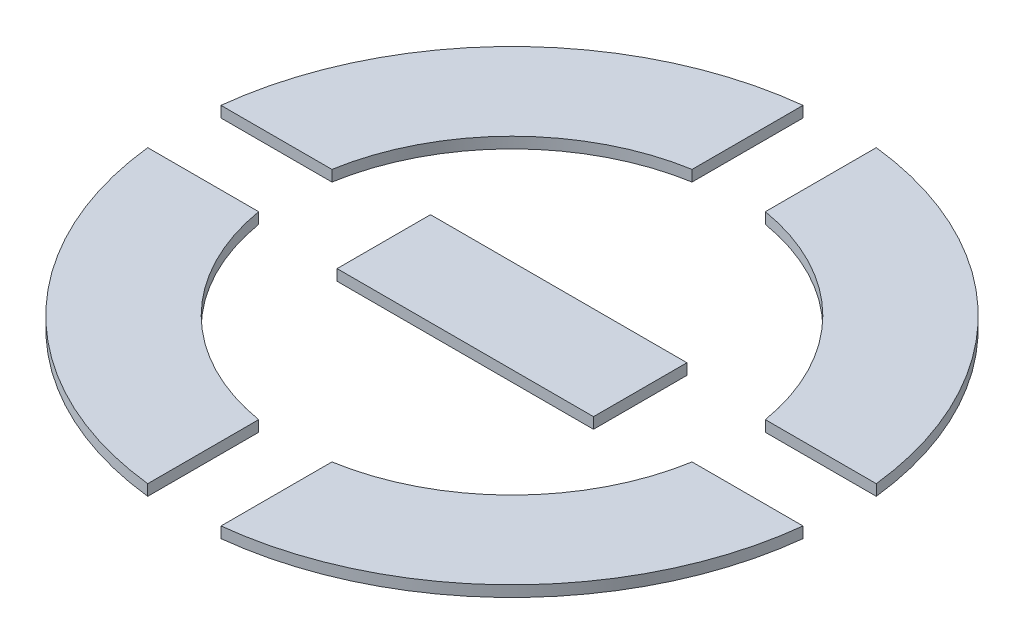
ISO-10303-21;
HEADER;
FILE_DESCRIPTION(('STEP AP214'),'2;1');
FILE_NAME('part.step','',(''),(''),'','','');
FILE_SCHEMA(('AUTOMOTIVE_DESIGN { 1 0 10303 214 1 1 1 1 }'));
ENDSEC;
DATA;
#1=APPLICATION_CONTEXT('core data for automotive mechanical design processes');
#2=APPLICATION_PROTOCOL_DEFINITION('international standard','automotive_design',2000,#1);
#3=PRODUCT_CONTEXT('',#1,'mechanical');
#4=PRODUCT('Part','Part','',(#3));
#5=PRODUCT_RELATED_PRODUCT_CATEGORY('part','',(#4));
#6=PRODUCT_DEFINITION_FORMATION('','',#4);
#7=PRODUCT_DEFINITION_CONTEXT('part definition',#1,'design');
#8=PRODUCT_DEFINITION('design','',#6,#7);
#9=PRODUCT_DEFINITION_SHAPE('','',#8);
#10=(LENGTH_UNIT() NAMED_UNIT(*) SI_UNIT(.MILLI.,.METRE.));
#11=(NAMED_UNIT(*) PLANE_ANGLE_UNIT() SI_UNIT($,.RADIAN.));
#12=(NAMED_UNIT(*) SI_UNIT($,.STERADIAN.) SOLID_ANGLE_UNIT());
#13=UNCERTAINTY_MEASURE_WITH_UNIT(LENGTH_MEASURE(1.E-05),#10,'distance_accuracy_value','');
#14=(GEOMETRIC_REPRESENTATION_CONTEXT(3) GLOBAL_UNCERTAINTY_ASSIGNED_CONTEXT((#13)) GLOBAL_UNIT_ASSIGNED_CONTEXT((#10,
#11,#12)) REPRESENTATION_CONTEXT('',''));
#15=CARTESIAN_POINT('',(0.,0.,0.));
#16=DIRECTION('',(0.,0.,1.));
#17=DIRECTION('',(1.,0.,0.));
#18=AXIS2_PLACEMENT_3D('',#15,#16,#17);
#19=CARTESIAN_POINT('',(0.,3.,0.));
#20=DIRECTION('',(0.,-1.,0.));
#21=DIRECTION('',(0.,0.,-1.));
#22=AXIS2_PLACEMENT_3D('',#19,#20,#21);
#23=CYLINDRICAL_SURFACE('',#22,60.);
#24=CARTESIAN_POINT('',(0.,0.,0.));
#25=DIRECTION('',(0.,-1.,0.));
#26=DIRECTION('',(0.,0.,1.));
#27=AXIS2_PLACEMENT_3D('',#24,#25,#26);
#28=CIRCLE('',#27,60.);
#29=CARTESIAN_POINT('',(-10.,0.,59.1607978309962));
#30=VERTEX_POINT('',#29);
#31=CARTESIAN_POINT('',(-59.1607978309962,0.,9.99999999999999));
#32=VERTEX_POINT('',#31);
#33=EDGE_CURVE('E130',#30,#32,#28,.T.);
#34=ORIENTED_EDGE('',*,*,#33,.T.);
#35=DIRECTION('',(0.,-1.,0.));
#36=VECTOR('',#35,1.);
#37=CARTESIAN_POINT('',(-59.1607978309962,3.,9.99999999999999));
#38=LINE('',#37,#36);
#39=CARTESIAN_POINT('',(-59.1607978309962,3.,9.99999999999999));
#40=VERTEX_POINT('',#39);
#41=EDGE_CURVE('E13',#40,#32,#38,.T.);
#42=ORIENTED_EDGE('',*,*,#41,.F.);
#43=CARTESIAN_POINT('',(0.,3.,0.));
#44=DIRECTION('',(0.,-1.,0.));
#45=DIRECTION('',(0.,0.,1.));
#46=AXIS2_PLACEMENT_3D('',#43,#44,#45);
#47=CIRCLE('',#46,60.);
#48=CARTESIAN_POINT('',(-10.,3.,59.1607978309962));
#49=VERTEX_POINT('',#48);
#50=EDGE_CURVE('E99',#49,#40,#47,.T.);
#51=ORIENTED_EDGE('',*,*,#50,.F.);
#52=DIRECTION('',(0.,-1.,0.));
#53=VECTOR('',#52,1.);
#54=CARTESIAN_POINT('',(-10.,3.,59.1607978309962));
#55=LINE('',#54,#53);
#56=EDGE_CURVE('E110',#49,#30,#55,.T.);
#57=ORIENTED_EDGE('',*,*,#56,.T.);
#58=EDGE_LOOP('',(#34,#42,#51,#57));
#59=FACE_BOUND('',#58,.T.);
#60=ADVANCED_FACE('F48',(#59),#23,.F.);
#61=CARTESIAN_POINT('',(-59.1607978309962,3.,9.99999999999999));
#62=DIRECTION('',(0.,0.,1.));
#63=DIRECTION('',(1.,0.,0.));
#64=AXIS2_PLACEMENT_3D('',#61,#62,#63);
#65=PLANE('',#64);
#66=DIRECTION('',(-1.,0.,0.));
#67=VECTOR('',#66,1.);
#68=CARTESIAN_POINT('',(-59.1607978309962,0.,9.99999999999999));
#69=LINE('',#68,#67);
#70=CARTESIAN_POINT('',(-89.4427190999916,0.,9.99999999999994));
#71=VERTEX_POINT('',#70);
#72=EDGE_CURVE('E104',#32,#71,#69,.T.);
#73=ORIENTED_EDGE('',*,*,#72,.T.);
#74=DIRECTION('',(0.,-1.,0.));
#75=VECTOR('',#74,1.);
#76=CARTESIAN_POINT('',(-89.4427190999916,3.,9.99999999999994));
#77=LINE('',#76,#75);
#78=CARTESIAN_POINT('',(-89.4427190999916,3.,9.99999999999994));
#79=VERTEX_POINT('',#78);
#80=EDGE_CURVE('E56',#79,#71,#77,.T.);
#81=ORIENTED_EDGE('',*,*,#80,.F.);
#82=DIRECTION('',(-1.,0.,0.));
#83=VECTOR('',#82,1.);
#84=CARTESIAN_POINT('',(-59.1607978309962,3.,9.99999999999999));
#85=LINE('',#84,#83);
#86=EDGE_CURVE('E94',#40,#79,#85,.T.);
#87=ORIENTED_EDGE('',*,*,#86,.F.);
#88=ORIENTED_EDGE('',*,*,#41,.T.);
#89=EDGE_LOOP('',(#73,#81,#87,#88));
#90=FACE_BOUND('',#89,.T.);
#91=ADVANCED_FACE('F103',(#90),#65,.F.);
#92=CARTESIAN_POINT('',(0.,3.,0.));
#93=DIRECTION('',(0.,-1.,0.));
#94=DIRECTION('',(0.,0.,-1.));
#95=AXIS2_PLACEMENT_3D('',#92,#93,#94);
#96=CYLINDRICAL_SURFACE('',#95,90.);
#97=CARTESIAN_POINT('',(0.,0.,0.));
#98=DIRECTION('',(0.,1.,0.));
#99=DIRECTION('',(0.,0.,1.));
#100=AXIS2_PLACEMENT_3D('',#97,#98,#99);
#101=CIRCLE('',#100,90.);
#102=CARTESIAN_POINT('',(-10.,0.,89.4427190999916));
#103=VERTEX_POINT('',#102);
#104=EDGE_CURVE('E81',#71,#103,#101,.T.);
#105=ORIENTED_EDGE('',*,*,#104,.T.);
#106=DIRECTION('',(0.,-1.,0.));
#107=VECTOR('',#106,1.);
#108=CARTESIAN_POINT('',(-10.,3.,89.4427190999916));
#109=LINE('',#108,#107);
#110=CARTESIAN_POINT('',(-10.,3.,89.4427190999916));
#111=VERTEX_POINT('',#110);
#112=EDGE_CURVE('E105',#111,#103,#109,.T.);
#113=ORIENTED_EDGE('',*,*,#112,.F.);
#114=CARTESIAN_POINT('',(0.,3.,0.));
#115=DIRECTION('',(0.,1.,0.));
#116=DIRECTION('',(0.,0.,1.));
#117=AXIS2_PLACEMENT_3D('',#114,#115,#116);
#118=CIRCLE('',#117,90.);
#119=EDGE_CURVE('E97',#79,#111,#118,.T.);
#120=ORIENTED_EDGE('',*,*,#119,.F.);
#121=ORIENTED_EDGE('',*,*,#80,.T.);
#122=EDGE_LOOP('',(#105,#113,#120,#121));
#123=FACE_BOUND('',#122,.T.);
#124=ADVANCED_FACE('F106',(#123),#96,.T.);
#125=CARTESIAN_POINT('',(-10.,3.,59.1607978309962));
#126=DIRECTION('',(-1.,0.,0.));
#127=DIRECTION('',(0.,0.,1.));
#128=AXIS2_PLACEMENT_3D('',#125,#126,#127);
#129=PLANE('',#128);
#130=DIRECTION('',(0.,0.,-1.));
#131=VECTOR('',#130,1.);
#132=CARTESIAN_POINT('',(-10.,0.,59.1607978309962));
#133=LINE('',#132,#131);
#134=EDGE_CURVE('E87',#103,#30,#133,.T.);
#135=ORIENTED_EDGE('',*,*,#134,.T.);
#136=ORIENTED_EDGE('',*,*,#56,.F.);
#137=DIRECTION('',(0.,0.,-1.));
#138=VECTOR('',#137,1.);
#139=CARTESIAN_POINT('',(-10.,3.,59.1607978309962));
#140=LINE('',#139,#138);
#141=EDGE_CURVE('E64',#111,#49,#140,.T.);
#142=ORIENTED_EDGE('',*,*,#141,.F.);
#143=ORIENTED_EDGE('',*,*,#112,.T.);
#144=EDGE_LOOP('',(#135,#136,#142,#143));
#145=FACE_BOUND('',#144,.T.);
#146=ADVANCED_FACE('F125',(#145),#129,.F.);
#147=CARTESIAN_POINT('',(0.,3.,0.));
#148=DIRECTION('',(0.,1.,0.));
#149=DIRECTION('',(0.,0.,1.));
#150=AXIS2_PLACEMENT_3D('',#147,#148,#149);
#151=PLANE('',#150);
#152=ORIENTED_EDGE('',*,*,#50,.T.);
#153=ORIENTED_EDGE('',*,*,#86,.T.);
#154=ORIENTED_EDGE('',*,*,#119,.T.);
#155=ORIENTED_EDGE('',*,*,#141,.T.);
#156=EDGE_LOOP('',(#152,#153,#154,#155));
#157=FACE_BOUND('',#156,.T.);
#158=ADVANCED_FACE('F95',(#157),#151,.T.);
#159=CARTESIAN_POINT('',(0.,0.,0.));
#160=DIRECTION('',(0.,1.,0.));
#161=DIRECTION('',(0.,0.,1.));
#162=AXIS2_PLACEMENT_3D('',#159,#160,#161);
#163=PLANE('',#162);
#164=ORIENTED_EDGE('',*,*,#33,.F.);
#165=ORIENTED_EDGE('',*,*,#134,.F.);
#166=ORIENTED_EDGE('',*,*,#104,.F.);
#167=ORIENTED_EDGE('',*,*,#72,.F.);
#168=EDGE_LOOP('',(#164,#165,#166,#167));
#169=FACE_BOUND('',#168,.T.);
#170=ADVANCED_FACE('F128',(#169),#163,.F.);
#171=CLOSED_SHELL('',(#60,#91,#124,#146,#158,#170));
#172=MANIFOLD_SOLID_BREP('B2',#171);
#173=CARTESIAN_POINT('',(0.,3.,0.));
#174=DIRECTION('',(0.,-1.,0.));
#175=DIRECTION('',(0.,0.,-1.));
#176=AXIS2_PLACEMENT_3D('',#173,#174,#175);
#177=CYLINDRICAL_SURFACE('',#176,60.);
#178=CARTESIAN_POINT('',(0.,0.,0.));
#179=DIRECTION('',(0.,-1.,0.));
#180=DIRECTION('',(0.,0.,1.));
#181=AXIS2_PLACEMENT_3D('',#178,#179,#180);
#182=CIRCLE('',#181,60.);
#183=CARTESIAN_POINT('',(59.1607978309962,0.,9.99999999999999));
#184=VERTEX_POINT('',#183);
#185=CARTESIAN_POINT('',(10.,0.,59.1607978309962));
#186=VERTEX_POINT('',#185);
#187=EDGE_CURVE('E276',#184,#186,#182,.T.);
#188=ORIENTED_EDGE('',*,*,#187,.T.);
#189=DIRECTION('',(0.,-1.,0.));
#190=VECTOR('',#189,1.);
#191=CARTESIAN_POINT('',(10.,3.,59.1607978309962));
#192=LINE('',#191,#190);
#193=CARTESIAN_POINT('',(10.,3.,59.1607978309962));
#194=VERTEX_POINT('',#193);
#195=EDGE_CURVE('E46',#194,#186,#192,.T.);
#196=ORIENTED_EDGE('',*,*,#195,.F.);
#197=CARTESIAN_POINT('',(0.,3.,0.));
#198=DIRECTION('',(0.,-1.,0.));
#199=DIRECTION('',(0.,0.,1.));
#200=AXIS2_PLACEMENT_3D('',#197,#198,#199);
#201=CIRCLE('',#200,60.);
#202=CARTESIAN_POINT('',(59.1607978309962,3.,9.99999999999999));
#203=VERTEX_POINT('',#202);
#204=EDGE_CURVE('E245',#203,#194,#201,.T.);
#205=ORIENTED_EDGE('',*,*,#204,.F.);
#206=DIRECTION('',(0.,-1.,0.));
#207=VECTOR('',#206,1.);
#208=CARTESIAN_POINT('',(59.1607978309962,3.,9.99999999999999));
#209=LINE('',#208,#207);
#210=EDGE_CURVE('E256',#203,#184,#209,.T.);
#211=ORIENTED_EDGE('',*,*,#210,.T.);
#212=EDGE_LOOP('',(#188,#196,#205,#211));
#213=FACE_BOUND('',#212,.T.);
#214=ADVANCED_FACE('F194',(#213),#177,.F.);
#215=CARTESIAN_POINT('',(10.,3.,59.1607978309962));
#216=DIRECTION('',(1.,0.,0.));
#217=DIRECTION('',(0.,0.,-1.));
#218=AXIS2_PLACEMENT_3D('',#215,#216,#217);
#219=PLANE('',#218);
#220=DIRECTION('',(0.,0.,1.));
#221=VECTOR('',#220,1.);
#222=CARTESIAN_POINT('',(10.,0.,59.1607978309962));
#223=LINE('',#222,#221);
#224=CARTESIAN_POINT('',(10.,0.,89.4427190999916));
#225=VERTEX_POINT('',#224);
#226=EDGE_CURVE('E250',#186,#225,#223,.T.);
#227=ORIENTED_EDGE('',*,*,#226,.T.);
#228=DIRECTION('',(0.,-1.,0.));
#229=VECTOR('',#228,1.);
#230=CARTESIAN_POINT('',(10.,3.,89.4427190999916));
#231=LINE('',#230,#229);
#232=CARTESIAN_POINT('',(10.,3.,89.4427190999916));
#233=VERTEX_POINT('',#232);
#234=EDGE_CURVE('E202',#233,#225,#231,.T.);
#235=ORIENTED_EDGE('',*,*,#234,.F.);
#236=DIRECTION('',(0.,0.,1.));
#237=VECTOR('',#236,1.);
#238=CARTESIAN_POINT('',(10.,3.,59.1607978309962));
#239=LINE('',#238,#237);
#240=EDGE_CURVE('E240',#194,#233,#239,.T.);
#241=ORIENTED_EDGE('',*,*,#240,.F.);
#242=ORIENTED_EDGE('',*,*,#195,.T.);
#243=EDGE_LOOP('',(#227,#235,#241,#242));
#244=FACE_BOUND('',#243,.T.);
#245=ADVANCED_FACE('F249',(#244),#219,.F.);
#246=CARTESIAN_POINT('',(0.,3.,0.));
#247=DIRECTION('',(0.,-1.,0.));
#248=DIRECTION('',(0.,0.,-1.));
#249=AXIS2_PLACEMENT_3D('',#246,#247,#248);
#250=CYLINDRICAL_SURFACE('',#249,90.);
#251=CARTESIAN_POINT('',(0.,0.,0.));
#252=DIRECTION('',(0.,1.,0.));
#253=DIRECTION('',(0.,0.,1.));
#254=AXIS2_PLACEMENT_3D('',#251,#252,#253);
#255=CIRCLE('',#254,90.);
#256=CARTESIAN_POINT('',(89.4427190999916,0.,9.99999999999998));
#257=VERTEX_POINT('',#256);
#258=EDGE_CURVE('E227',#225,#257,#255,.T.);
#259=ORIENTED_EDGE('',*,*,#258,.T.);
#260=DIRECTION('',(0.,-1.,0.));
#261=VECTOR('',#260,1.);
#262=CARTESIAN_POINT('',(89.4427190999916,3.,9.99999999999998));
#263=LINE('',#262,#261);
#264=CARTESIAN_POINT('',(89.4427190999916,3.,9.99999999999998));
#265=VERTEX_POINT('',#264);
#266=EDGE_CURVE('E251',#265,#257,#263,.T.);
#267=ORIENTED_EDGE('',*,*,#266,.F.);
#268=CARTESIAN_POINT('',(0.,3.,0.));
#269=DIRECTION('',(0.,1.,0.));
#270=DIRECTION('',(0.,0.,1.));
#271=AXIS2_PLACEMENT_3D('',#268,#269,#270);
#272=CIRCLE('',#271,90.);
#273=EDGE_CURVE('E243',#233,#265,#272,.T.);
#274=ORIENTED_EDGE('',*,*,#273,.F.);
#275=ORIENTED_EDGE('',*,*,#234,.T.);
#276=EDGE_LOOP('',(#259,#267,#274,#275));
#277=FACE_BOUND('',#276,.T.);
#278=ADVANCED_FACE('F252',(#277),#250,.T.);
#279=CARTESIAN_POINT('',(59.1607978309962,3.,9.99999999999999));
#280=DIRECTION('',(0.,0.,1.));
#281=DIRECTION('',(1.,0.,0.));
#282=AXIS2_PLACEMENT_3D('',#279,#280,#281);
#283=PLANE('',#282);
#284=DIRECTION('',(-1.,0.,0.));
#285=VECTOR('',#284,1.);
#286=CARTESIAN_POINT('',(59.1607978309962,0.,9.99999999999999));
#287=LINE('',#286,#285);
#288=EDGE_CURVE('E233',#257,#184,#287,.T.);
#289=ORIENTED_EDGE('',*,*,#288,.T.);
#290=ORIENTED_EDGE('',*,*,#210,.F.);
#291=DIRECTION('',(-1.,0.,0.));
#292=VECTOR('',#291,1.);
#293=CARTESIAN_POINT('',(59.1607978309962,3.,9.99999999999999));
#294=LINE('',#293,#292);
#295=EDGE_CURVE('E210',#265,#203,#294,.T.);
#296=ORIENTED_EDGE('',*,*,#295,.F.);
#297=ORIENTED_EDGE('',*,*,#266,.T.);
#298=EDGE_LOOP('',(#289,#290,#296,#297));
#299=FACE_BOUND('',#298,.T.);
#300=ADVANCED_FACE('F271',(#299),#283,.F.);
#301=CARTESIAN_POINT('',(0.,3.,0.));
#302=DIRECTION('',(0.,1.,0.));
#303=DIRECTION('',(0.,0.,1.));
#304=AXIS2_PLACEMENT_3D('',#301,#302,#303);
#305=PLANE('',#304);
#306=ORIENTED_EDGE('',*,*,#204,.T.);
#307=ORIENTED_EDGE('',*,*,#240,.T.);
#308=ORIENTED_EDGE('',*,*,#273,.T.);
#309=ORIENTED_EDGE('',*,*,#295,.T.);
#310=EDGE_LOOP('',(#306,#307,#308,#309));
#311=FACE_BOUND('',#310,.T.);
#312=ADVANCED_FACE('F241',(#311),#305,.T.);
#313=CARTESIAN_POINT('',(0.,0.,0.));
#314=DIRECTION('',(0.,1.,0.));
#315=DIRECTION('',(0.,0.,1.));
#316=AXIS2_PLACEMENT_3D('',#313,#314,#315);
#317=PLANE('',#316);
#318=ORIENTED_EDGE('',*,*,#187,.F.);
#319=ORIENTED_EDGE('',*,*,#288,.F.);
#320=ORIENTED_EDGE('',*,*,#258,.F.);
#321=ORIENTED_EDGE('',*,*,#226,.F.);
#322=EDGE_LOOP('',(#318,#319,#320,#321));
#323=FACE_BOUND('',#322,.T.);
#324=ADVANCED_FACE('F274',(#323),#317,.F.);
#325=CLOSED_SHELL('',(#214,#245,#278,#300,#312,#324));
#326=MANIFOLD_SOLID_BREP('B7',#325);
#327=CARTESIAN_POINT('',(0.,3.,0.));
#328=DIRECTION('',(0.,-1.,0.));
#329=DIRECTION('',(0.,0.,-1.));
#330=AXIS2_PLACEMENT_3D('',#327,#328,#329);
#331=CYLINDRICAL_SURFACE('',#330,60.);
#332=CARTESIAN_POINT('',(0.,0.,0.));
#333=DIRECTION('',(0.,-1.,0.));
#334=DIRECTION('',(0.,0.,1.));
#335=AXIS2_PLACEMENT_3D('',#332,#333,#334);
#336=CIRCLE('',#335,60.);
#337=CARTESIAN_POINT('',(10.,0.,-59.1607978309962));
#338=VERTEX_POINT('',#337);
#339=CARTESIAN_POINT('',(59.1607978309962,0.,-9.99999999999999));
#340=VERTEX_POINT('',#339);
#341=EDGE_CURVE('E422',#338,#340,#336,.T.);
#342=ORIENTED_EDGE('',*,*,#341,.T.);
#343=DIRECTION('',(0.,-1.,0.));
#344=VECTOR('',#343,1.);
#345=CARTESIAN_POINT('',(59.1607978309962,3.,-9.99999999999999));
#346=LINE('',#345,#344);
#347=CARTESIAN_POINT('',(59.1607978309962,3.,-9.99999999999999));
#348=VERTEX_POINT('',#347);
#349=EDGE_CURVE('E192',#348,#340,#346,.T.);
#350=ORIENTED_EDGE('',*,*,#349,.F.);
#351=CARTESIAN_POINT('',(0.,3.,0.));
#352=DIRECTION('',(0.,-1.,0.));
#353=DIRECTION('',(0.,0.,1.));
#354=AXIS2_PLACEMENT_3D('',#351,#352,#353);
#355=CIRCLE('',#354,60.);
#356=CARTESIAN_POINT('',(10.,3.,-59.1607978309962));
#357=VERTEX_POINT('',#356);
#358=EDGE_CURVE('E391',#357,#348,#355,.T.);
#359=ORIENTED_EDGE('',*,*,#358,.F.);
#360=DIRECTION('',(0.,-1.,0.));
#361=VECTOR('',#360,1.);
#362=CARTESIAN_POINT('',(10.,3.,-59.1607978309962));
#363=LINE('',#362,#361);
#364=EDGE_CURVE('E402',#357,#338,#363,.T.);
#365=ORIENTED_EDGE('',*,*,#364,.T.);
#366=EDGE_LOOP('',(#342,#350,#359,#365));
#367=FACE_BOUND('',#366,.T.);
#368=ADVANCED_FACE('F340',(#367),#331,.F.);
#369=CARTESIAN_POINT('',(59.1607978309962,3.,-9.99999999999999));
#370=DIRECTION('',(0.,0.,-1.));
#371=DIRECTION('',(-1.,0.,0.));
#372=AXIS2_PLACEMENT_3D('',#369,#370,#371);
#373=PLANE('',#372);
#374=DIRECTION('',(1.,0.,0.));
#375=VECTOR('',#374,1.);
#376=CARTESIAN_POINT('',(59.1607978309962,0.,-9.99999999999999));
#377=LINE('',#376,#375);
#378=CARTESIAN_POINT('',(89.4427190999916,0.,-9.99999999999999));
#379=VERTEX_POINT('',#378);
#380=EDGE_CURVE('E396',#340,#379,#377,.T.);
#381=ORIENTED_EDGE('',*,*,#380,.T.);
#382=DIRECTION('',(0.,-1.,0.));
#383=VECTOR('',#382,1.);
#384=CARTESIAN_POINT('',(89.4427190999916,3.,-9.99999999999999));
#385=LINE('',#384,#383);
#386=CARTESIAN_POINT('',(89.4427190999916,3.,-9.99999999999999));
#387=VERTEX_POINT('',#386);
#388=EDGE_CURVE('E348',#387,#379,#385,.T.);
#389=ORIENTED_EDGE('',*,*,#388,.F.);
#390=DIRECTION('',(1.,0.,0.));
#391=VECTOR('',#390,1.);
#392=CARTESIAN_POINT('',(59.1607978309962,3.,-9.99999999999999));
#393=LINE('',#392,#391);
#394=EDGE_CURVE('E386',#348,#387,#393,.T.);
#395=ORIENTED_EDGE('',*,*,#394,.F.);
#396=ORIENTED_EDGE('',*,*,#349,.T.);
#397=EDGE_LOOP('',(#381,#389,#395,#396));
#398=FACE_BOUND('',#397,.T.);
#399=ADVANCED_FACE('F395',(#398),#373,.F.);
#400=CARTESIAN_POINT('',(0.,3.,0.));
#401=DIRECTION('',(0.,-1.,0.));
#402=DIRECTION('',(0.,0.,-1.));
#403=AXIS2_PLACEMENT_3D('',#400,#401,#402);
#404=CYLINDRICAL_SURFACE('',#403,90.);
#405=CARTESIAN_POINT('',(0.,0.,0.));
#406=DIRECTION('',(0.,1.,0.));
#407=DIRECTION('',(0.,0.,1.));
#408=AXIS2_PLACEMENT_3D('',#405,#406,#407);
#409=CIRCLE('',#408,90.);
#410=CARTESIAN_POINT('',(10.,0.,-89.4427190999916));
#411=VERTEX_POINT('',#410);
#412=EDGE_CURVE('E373',#379,#411,#409,.T.);
#413=ORIENTED_EDGE('',*,*,#412,.T.);
#414=DIRECTION('',(0.,-1.,0.));
#415=VECTOR('',#414,1.);
#416=CARTESIAN_POINT('',(10.,3.,-89.4427190999916));
#417=LINE('',#416,#415);
#418=CARTESIAN_POINT('',(10.,3.,-89.4427190999916));
#419=VERTEX_POINT('',#418);
#420=EDGE_CURVE('E397',#419,#411,#417,.T.);
#421=ORIENTED_EDGE('',*,*,#420,.F.);
#422=CARTESIAN_POINT('',(0.,3.,0.));
#423=DIRECTION('',(0.,1.,0.));
#424=DIRECTION('',(0.,0.,1.));
#425=AXIS2_PLACEMENT_3D('',#422,#423,#424);
#426=CIRCLE('',#425,90.);
#427=EDGE_CURVE('E389',#387,#419,#426,.T.);
#428=ORIENTED_EDGE('',*,*,#427,.F.);
#429=ORIENTED_EDGE('',*,*,#388,.T.);
#430=EDGE_LOOP('',(#413,#421,#428,#429));
#431=FACE_BOUND('',#430,.T.);
#432=ADVANCED_FACE('F398',(#431),#404,.T.);
#433=CARTESIAN_POINT('',(10.,3.,-59.1607978309962));
#434=DIRECTION('',(1.,0.,0.));
#435=DIRECTION('',(0.,0.,-1.));
#436=AXIS2_PLACEMENT_3D('',#433,#434,#435);
#437=PLANE('',#436);
#438=DIRECTION('',(0.,0.,1.));
#439=VECTOR('',#438,1.);
#440=CARTESIAN_POINT('',(10.,0.,-59.1607978309962));
#441=LINE('',#440,#439);
#442=EDGE_CURVE('E379',#411,#338,#441,.T.);
#443=ORIENTED_EDGE('',*,*,#442,.T.);
#444=ORIENTED_EDGE('',*,*,#364,.F.);
#445=DIRECTION('',(0.,0.,1.));
#446=VECTOR('',#445,1.);
#447=CARTESIAN_POINT('',(10.,3.,-59.1607978309962));
#448=LINE('',#447,#446);
#449=EDGE_CURVE('E356',#419,#357,#448,.T.);
#450=ORIENTED_EDGE('',*,*,#449,.F.);
#451=ORIENTED_EDGE('',*,*,#420,.T.);
#452=EDGE_LOOP('',(#443,#444,#450,#451));
#453=FACE_BOUND('',#452,.T.);
#454=ADVANCED_FACE('F417',(#453),#437,.F.);
#455=CARTESIAN_POINT('',(0.,3.,0.));
#456=DIRECTION('',(0.,1.,0.));
#457=DIRECTION('',(0.,0.,1.));
#458=AXIS2_PLACEMENT_3D('',#455,#456,#457);
#459=PLANE('',#458);
#460=ORIENTED_EDGE('',*,*,#358,.T.);
#461=ORIENTED_EDGE('',*,*,#394,.T.);
#462=ORIENTED_EDGE('',*,*,#427,.T.);
#463=ORIENTED_EDGE('',*,*,#449,.T.);
#464=EDGE_LOOP('',(#460,#461,#462,#463));
#465=FACE_BOUND('',#464,.T.);
#466=ADVANCED_FACE('F387',(#465),#459,.T.);
#467=CARTESIAN_POINT('',(0.,0.,0.));
#468=DIRECTION('',(0.,1.,0.));
#469=DIRECTION('',(0.,0.,1.));
#470=AXIS2_PLACEMENT_3D('',#467,#468,#469);
#471=PLANE('',#470);
#472=ORIENTED_EDGE('',*,*,#341,.F.);
#473=ORIENTED_EDGE('',*,*,#442,.F.);
#474=ORIENTED_EDGE('',*,*,#412,.F.);
#475=ORIENTED_EDGE('',*,*,#380,.F.);
#476=EDGE_LOOP('',(#472,#473,#474,#475));
#477=FACE_BOUND('',#476,.T.);
#478=ADVANCED_FACE('F420',(#477),#471,.F.);
#479=CLOSED_SHELL('',(#368,#399,#432,#454,#466,#478));
#480=MANIFOLD_SOLID_BREP('B40',#479);
#481=CARTESIAN_POINT('',(0.,3.,0.));
#482=DIRECTION('',(0.,-1.,0.));
#483=DIRECTION('',(0.,0.,-1.));
#484=AXIS2_PLACEMENT_3D('',#481,#482,#483);
#485=CYLINDRICAL_SURFACE('',#484,60.);
#486=CARTESIAN_POINT('',(0.,0.,0.));
#487=DIRECTION('',(0.,-1.,0.));
#488=DIRECTION('',(0.,0.,1.));
#489=AXIS2_PLACEMENT_3D('',#486,#487,#488);
#490=CIRCLE('',#489,60.);
#491=CARTESIAN_POINT('',(-59.1607978309962,0.,-9.99999999999999));
#492=VERTEX_POINT('',#491);
#493=CARTESIAN_POINT('',(-10.,0.,-59.1607978309962));
#494=VERTEX_POINT('',#493);
#495=EDGE_CURVE('E567',#492,#494,#490,.T.);
#496=ORIENTED_EDGE('',*,*,#495,.T.);
#497=DIRECTION('',(0.,-1.,0.));
#498=VECTOR('',#497,1.);
#499=CARTESIAN_POINT('',(-10.,3.,-59.1607978309962));
#500=LINE('',#499,#498);
#501=CARTESIAN_POINT('',(-10.,3.,-59.1607978309962));
#502=VERTEX_POINT('',#501);
#503=EDGE_CURVE('E338',#502,#494,#500,.T.);
#504=ORIENTED_EDGE('',*,*,#503,.F.);
#505=CARTESIAN_POINT('',(0.,3.,0.));
#506=DIRECTION('',(0.,-1.,0.));
#507=DIRECTION('',(0.,0.,1.));
#508=AXIS2_PLACEMENT_3D('',#505,#506,#507);
#509=CIRCLE('',#508,60.);
#510=CARTESIAN_POINT('',(-59.1607978309962,3.,-9.99999999999999));
#511=VERTEX_POINT('',#510);
#512=EDGE_CURVE('E536',#511,#502,#509,.T.);
#513=ORIENTED_EDGE('',*,*,#512,.F.);
#514=DIRECTION('',(0.,-1.,0.));
#515=VECTOR('',#514,1.);
#516=CARTESIAN_POINT('',(-59.1607978309962,3.,-9.99999999999999));
#517=LINE('',#516,#515);
#518=EDGE_CURVE('E547',#511,#492,#517,.T.);
#519=ORIENTED_EDGE('',*,*,#518,.T.);
#520=EDGE_LOOP('',(#496,#504,#513,#519));
#521=FACE_BOUND('',#520,.T.);
#522=ADVANCED_FACE('F485',(#521),#485,.F.);
#523=CARTESIAN_POINT('',(-10.,3.,-59.1607978309962));
#524=DIRECTION('',(-1.,0.,0.));
#525=DIRECTION('',(0.,0.,1.));
#526=AXIS2_PLACEMENT_3D('',#523,#524,#525);
#527=PLANE('',#526);
#528=DIRECTION('',(0.,0.,-1.));
#529=VECTOR('',#528,1.);
#530=CARTESIAN_POINT('',(-10.,0.,-59.1607978309962));
#531=LINE('',#530,#529);
#532=CARTESIAN_POINT('',(-10.,0.,-89.4427190999916));
#533=VERTEX_POINT('',#532);
#534=EDGE_CURVE('E541',#494,#533,#531,.T.);
#535=ORIENTED_EDGE('',*,*,#534,.T.);
#536=DIRECTION('',(0.,-1.,0.));
#537=VECTOR('',#536,1.);
#538=CARTESIAN_POINT('',(-10.,3.,-89.4427190999916));
#539=LINE('',#538,#537);
#540=CARTESIAN_POINT('',(-10.,3.,-89.4427190999916));
#541=VERTEX_POINT('',#540);
#542=EDGE_CURVE('E493',#541,#533,#539,.T.);
#543=ORIENTED_EDGE('',*,*,#542,.F.);
#544=DIRECTION('',(0.,0.,-1.));
#545=VECTOR('',#544,1.);
#546=CARTESIAN_POINT('',(-10.,3.,-59.1607978309962));
#547=LINE('',#546,#545);
#548=EDGE_CURVE('E531',#502,#541,#547,.T.);
#549=ORIENTED_EDGE('',*,*,#548,.F.);
#550=ORIENTED_EDGE('',*,*,#503,.T.);
#551=EDGE_LOOP('',(#535,#543,#549,#550));
#552=FACE_BOUND('',#551,.T.);
#553=ADVANCED_FACE('F540',(#552),#527,.F.);
#554=CARTESIAN_POINT('',(0.,3.,0.));
#555=DIRECTION('',(0.,-1.,0.));
#556=DIRECTION('',(0.,0.,-1.));
#557=AXIS2_PLACEMENT_3D('',#554,#555,#556);
#558=CYLINDRICAL_SURFACE('',#557,90.);
#559=CARTESIAN_POINT('',(0.,0.,0.));
#560=DIRECTION('',(0.,1.,0.));
#561=DIRECTION('',(0.,0.,1.));
#562=AXIS2_PLACEMENT_3D('',#559,#560,#561);
#563=CIRCLE('',#562,90.);
#564=CARTESIAN_POINT('',(-89.4427190999916,0.,-9.99999999999998));
#565=VERTEX_POINT('',#564);
#566=EDGE_CURVE('E518',#533,#565,#563,.T.);
#567=ORIENTED_EDGE('',*,*,#566,.T.);
#568=DIRECTION('',(0.,-1.,0.));
#569=VECTOR('',#568,1.);
#570=CARTESIAN_POINT('',(-89.4427190999916,3.,-9.99999999999998));
#571=LINE('',#570,#569);
#572=CARTESIAN_POINT('',(-89.4427190999916,3.,-9.99999999999998));
#573=VERTEX_POINT('',#572);
#574=EDGE_CURVE('E542',#573,#565,#571,.T.);
#575=ORIENTED_EDGE('',*,*,#574,.F.);
#576=CARTESIAN_POINT('',(0.,3.,0.));
#577=DIRECTION('',(0.,1.,0.));
#578=DIRECTION('',(0.,0.,1.));
#579=AXIS2_PLACEMENT_3D('',#576,#577,#578);
#580=CIRCLE('',#579,90.);
#581=EDGE_CURVE('E534',#541,#573,#580,.T.);
#582=ORIENTED_EDGE('',*,*,#581,.F.);
#583=ORIENTED_EDGE('',*,*,#542,.T.);
#584=EDGE_LOOP('',(#567,#575,#582,#583));
#585=FACE_BOUND('',#584,.T.);
#586=ADVANCED_FACE('F543',(#585),#558,.T.);
#587=CARTESIAN_POINT('',(-59.1607978309962,3.,-9.99999999999999));
#588=DIRECTION('',(0.,0.,-1.));
#589=DIRECTION('',(-1.,0.,0.));
#590=AXIS2_PLACEMENT_3D('',#587,#588,#589);
#591=PLANE('',#590);
#592=DIRECTION('',(1.,0.,0.));
#593=VECTOR('',#592,1.);
#594=CARTESIAN_POINT('',(-59.1607978309962,0.,-9.99999999999999));
#595=LINE('',#594,#593);
#596=EDGE_CURVE('E524',#565,#492,#595,.T.);
#597=ORIENTED_EDGE('',*,*,#596,.T.);
#598=ORIENTED_EDGE('',*,*,#518,.F.);
#599=DIRECTION('',(1.,0.,0.));
#600=VECTOR('',#599,1.);
#601=CARTESIAN_POINT('',(-59.1607978309962,3.,-9.99999999999999));
#602=LINE('',#601,#600);
#603=EDGE_CURVE('E501',#573,#511,#602,.T.);
#604=ORIENTED_EDGE('',*,*,#603,.F.);
#605=ORIENTED_EDGE('',*,*,#574,.T.);
#606=EDGE_LOOP('',(#597,#598,#604,#605));
#607=FACE_BOUND('',#606,.T.);
#608=ADVANCED_FACE('F562',(#607),#591,.F.);
#609=CARTESIAN_POINT('',(0.,3.,0.));
#610=DIRECTION('',(0.,1.,0.));
#611=DIRECTION('',(0.,0.,1.));
#612=AXIS2_PLACEMENT_3D('',#609,#610,#611);
#613=PLANE('',#612);
#614=ORIENTED_EDGE('',*,*,#512,.T.);
#615=ORIENTED_EDGE('',*,*,#548,.T.);
#616=ORIENTED_EDGE('',*,*,#581,.T.);
#617=ORIENTED_EDGE('',*,*,#603,.T.);
#618=EDGE_LOOP('',(#614,#615,#616,#617));
#619=FACE_BOUND('',#618,.T.);
#620=ADVANCED_FACE('F532',(#619),#613,.T.);
#621=CARTESIAN_POINT('',(0.,0.,0.));
#622=DIRECTION('',(0.,1.,0.));
#623=DIRECTION('',(0.,0.,1.));
#624=AXIS2_PLACEMENT_3D('',#621,#622,#623);
#625=PLANE('',#624);
#626=ORIENTED_EDGE('',*,*,#495,.F.);
#627=ORIENTED_EDGE('',*,*,#596,.F.);
#628=ORIENTED_EDGE('',*,*,#566,.F.);
#629=ORIENTED_EDGE('',*,*,#534,.F.);
#630=EDGE_LOOP('',(#626,#627,#628,#629));
#631=FACE_BOUND('',#630,.T.);
#632=ADVANCED_FACE('F565',(#631),#625,.F.);
#633=CLOSED_SHELL('',(#522,#553,#586,#608,#620,#632));
#634=MANIFOLD_SOLID_BREP('B186',#633);
#635=CARTESIAN_POINT('',(35.,3.,-12.75));
#636=DIRECTION('',(-1.,0.,0.));
#637=DIRECTION('',(0.,0.,1.));
#638=AXIS2_PLACEMENT_3D('',#635,#636,#637);
#639=PLANE('',#638);
#640=DIRECTION('',(0.,0.,-1.));
#641=VECTOR('',#640,1.);
#642=CARTESIAN_POINT('',(35.,0.,-12.75));
#643=LINE('',#642,#641);
#644=CARTESIAN_POINT('',(35.,0.,12.75));
#645=VERTEX_POINT('',#644);
#646=CARTESIAN_POINT('',(35.,0.,-12.75));
#647=VERTEX_POINT('',#646);
#648=EDGE_CURVE('E702',#645,#647,#643,.T.);
#649=ORIENTED_EDGE('',*,*,#648,.T.);
#650=DIRECTION('',(0.,-1.,0.));
#651=VECTOR('',#650,1.);
#652=CARTESIAN_POINT('',(35.,3.,-12.75));
#653=LINE('',#652,#651);
#654=CARTESIAN_POINT('',(35.,3.,-12.75));
#655=VERTEX_POINT('',#654);
#656=EDGE_CURVE('E483',#655,#647,#653,.T.);
#657=ORIENTED_EDGE('',*,*,#656,.F.);
#658=DIRECTION('',(0.,0.,-1.));
#659=VECTOR('',#658,1.);
#660=CARTESIAN_POINT('',(35.,3.,-12.75));
#661=LINE('',#660,#659);
#662=CARTESIAN_POINT('',(35.,3.,12.75));
#663=VERTEX_POINT('',#662);
#664=EDGE_CURVE('E671',#663,#655,#661,.T.);
#665=ORIENTED_EDGE('',*,*,#664,.F.);
#666=DIRECTION('',(0.,-1.,0.));
#667=VECTOR('',#666,1.);
#668=CARTESIAN_POINT('',(35.,3.,12.75));
#669=LINE('',#668,#667);
#670=EDGE_CURVE('E682',#663,#645,#669,.T.);
#671=ORIENTED_EDGE('',*,*,#670,.T.);
#672=EDGE_LOOP('',(#649,#657,#665,#671));
#673=FACE_BOUND('',#672,.T.);
#674=ADVANCED_FACE('F620',(#673),#639,.F.);
#675=CARTESIAN_POINT('',(-35.,3.,-12.75));
#676=DIRECTION('',(0.,0.,1.));
#677=DIRECTION('',(1.,0.,0.));
#678=AXIS2_PLACEMENT_3D('',#675,#676,#677);
#679=PLANE('',#678);
#680=DIRECTION('',(-1.,0.,0.));
#681=VECTOR('',#680,1.);
#682=CARTESIAN_POINT('',(-35.,0.,-12.75));
#683=LINE('',#682,#681);
#684=CARTESIAN_POINT('',(-35.,0.,-12.75));
#685=VERTEX_POINT('',#684);
#686=EDGE_CURVE('E676',#647,#685,#683,.T.);
#687=ORIENTED_EDGE('',*,*,#686,.T.);
#688=DIRECTION('',(0.,-1.,0.));
#689=VECTOR('',#688,1.);
#690=CARTESIAN_POINT('',(-35.,3.,-12.75));
#691=LINE('',#690,#689);
#692=CARTESIAN_POINT('',(-35.,3.,-12.75));
#693=VERTEX_POINT('',#692);
#694=EDGE_CURVE('E628',#693,#685,#691,.T.);
#695=ORIENTED_EDGE('',*,*,#694,.F.);
#696=DIRECTION('',(-1.,0.,0.));
#697=VECTOR('',#696,1.);
#698=CARTESIAN_POINT('',(-35.,3.,-12.75));
#699=LINE('',#698,#697);
#700=EDGE_CURVE('E666',#655,#693,#699,.T.);
#701=ORIENTED_EDGE('',*,*,#700,.F.);
#702=ORIENTED_EDGE('',*,*,#656,.T.);
#703=EDGE_LOOP('',(#687,#695,#701,#702));
#704=FACE_BOUND('',#703,.T.);
#705=ADVANCED_FACE('F675',(#704),#679,.F.);
#706=CARTESIAN_POINT('',(-35.,3.,-12.75));
#707=DIRECTION('',(1.,0.,0.));
#708=DIRECTION('',(0.,0.,-1.));
#709=AXIS2_PLACEMENT_3D('',#706,#707,#708);
#710=PLANE('',#709);
#711=DIRECTION('',(0.,0.,1.));
#712=VECTOR('',#711,1.);
#713=CARTESIAN_POINT('',(-35.,0.,-12.75));
#714=LINE('',#713,#712);
#715=CARTESIAN_POINT('',(-35.,0.,12.75));
#716=VERTEX_POINT('',#715);
#717=EDGE_CURVE('E653',#685,#716,#714,.T.);
#718=ORIENTED_EDGE('',*,*,#717,.T.);
#719=DIRECTION('',(0.,-1.,0.));
#720=VECTOR('',#719,1.);
#721=CARTESIAN_POINT('',(-35.,3.,12.75));
#722=LINE('',#721,#720);
#723=CARTESIAN_POINT('',(-35.,3.,12.75));
#724=VERTEX_POINT('',#723);
#725=EDGE_CURVE('E677',#724,#716,#722,.T.);
#726=ORIENTED_EDGE('',*,*,#725,.F.);
#727=DIRECTION('',(0.,0.,1.));
#728=VECTOR('',#727,1.);
#729=CARTESIAN_POINT('',(-35.,3.,-12.75));
#730=LINE('',#729,#728);
#731=EDGE_CURVE('E669',#693,#724,#730,.T.);
#732=ORIENTED_EDGE('',*,*,#731,.F.);
#733=ORIENTED_EDGE('',*,*,#694,.T.);
#734=EDGE_LOOP('',(#718,#726,#732,#733));
#735=FACE_BOUND('',#734,.T.);
#736=ADVANCED_FACE('F678',(#735),#710,.F.);
#737=CARTESIAN_POINT('',(-35.,3.,12.75));
#738=DIRECTION('',(0.,0.,-1.));
#739=DIRECTION('',(-1.,0.,0.));
#740=AXIS2_PLACEMENT_3D('',#737,#738,#739);
#741=PLANE('',#740);
#742=DIRECTION('',(1.,0.,0.));
#743=VECTOR('',#742,1.);
#744=CARTESIAN_POINT('',(-35.,0.,12.75));
#745=LINE('',#744,#743);
#746=EDGE_CURVE('E659',#716,#645,#745,.T.);
#747=ORIENTED_EDGE('',*,*,#746,.T.);
#748=ORIENTED_EDGE('',*,*,#670,.F.);
#749=DIRECTION('',(1.,0.,0.));
#750=VECTOR('',#749,1.);
#751=CARTESIAN_POINT('',(-35.,3.,12.75));
#752=LINE('',#751,#750);
#753=EDGE_CURVE('E636',#724,#663,#752,.T.);
#754=ORIENTED_EDGE('',*,*,#753,.F.);
#755=ORIENTED_EDGE('',*,*,#725,.T.);
#756=EDGE_LOOP('',(#747,#748,#754,#755));
#757=FACE_BOUND('',#756,.T.);
#758=ADVANCED_FACE('F697',(#757),#741,.F.);
#759=CARTESIAN_POINT('',(0.,3.,0.));
#760=DIRECTION('',(0.,1.,0.));
#761=DIRECTION('',(0.,0.,1.));
#762=AXIS2_PLACEMENT_3D('',#759,#760,#761);
#763=PLANE('',#762);
#764=ORIENTED_EDGE('',*,*,#664,.T.);
#765=ORIENTED_EDGE('',*,*,#700,.T.);
#766=ORIENTED_EDGE('',*,*,#731,.T.);
#767=ORIENTED_EDGE('',*,*,#753,.T.);
#768=EDGE_LOOP('',(#764,#765,#766,#767));
#769=FACE_BOUND('',#768,.T.);
#770=ADVANCED_FACE('F667',(#769),#763,.T.);
#771=CARTESIAN_POINT('',(0.,0.,0.));
#772=DIRECTION('',(0.,1.,0.));
#773=DIRECTION('',(0.,0.,1.));
#774=AXIS2_PLACEMENT_3D('',#771,#772,#773);
#775=PLANE('',#774);
#776=ORIENTED_EDGE('',*,*,#648,.F.);
#777=ORIENTED_EDGE('',*,*,#746,.F.);
#778=ORIENTED_EDGE('',*,*,#717,.F.);
#779=ORIENTED_EDGE('',*,*,#686,.F.);
#780=EDGE_LOOP('',(#776,#777,#778,#779));
#781=FACE_BOUND('',#780,.T.);
#782=ADVANCED_FACE('F700',(#781),#775,.F.);
#783=CLOSED_SHELL('',(#674,#705,#736,#758,#770,#782));
#784=MANIFOLD_SOLID_BREP('B332',#783);
#785=ADVANCED_BREP_SHAPE_REPRESENTATION('',(#18,#172,#326,#480,#634,#784),#14);
#786=SHAPE_DEFINITION_REPRESENTATION(#9,#785);
ENDSEC;
END-ISO-10303-21;
